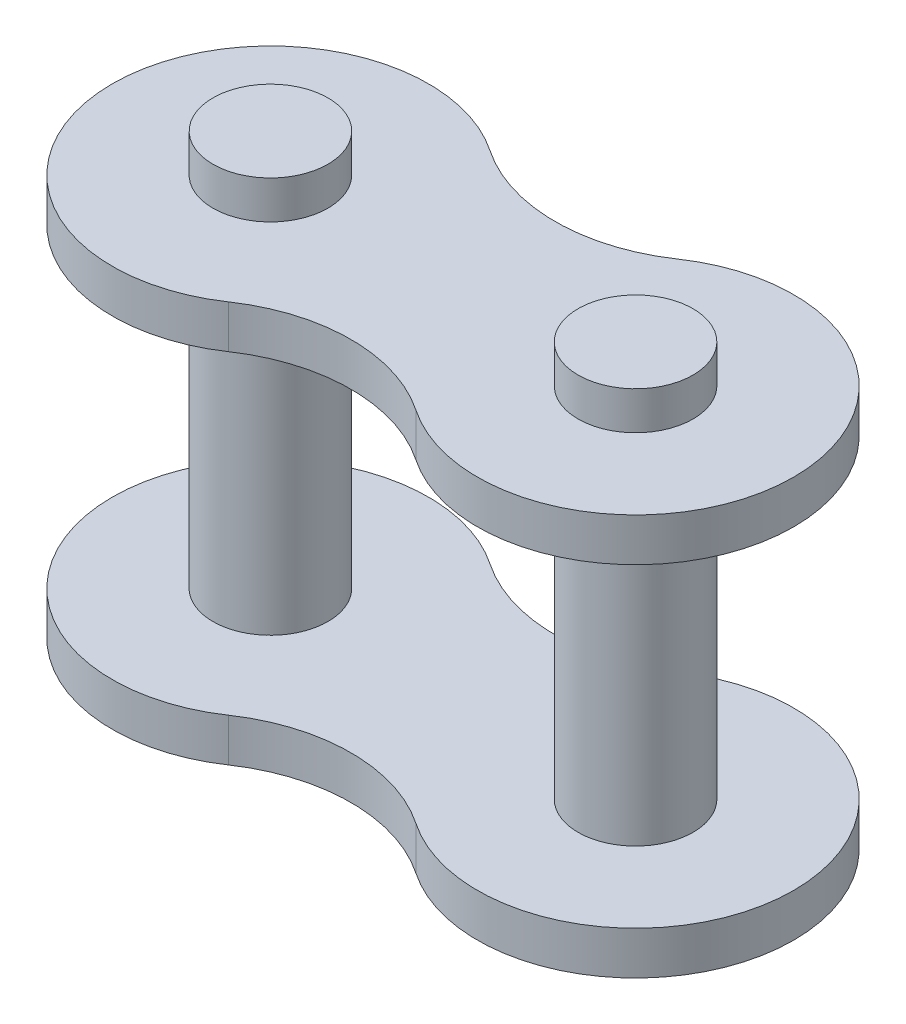
ISO-10303-21;
HEADER;
FILE_DESCRIPTION(('STEP AP214'),'2;1');
FILE_NAME('part.step','',(''),(''),'','','');
FILE_SCHEMA(('AUTOMOTIVE_DESIGN { 1 0 10303 214 1 1 1 1 }'));
ENDSEC;
DATA;
#1=APPLICATION_CONTEXT('core data for automotive mechanical design processes');
#2=APPLICATION_PROTOCOL_DEFINITION('international standard','automotive_design',2000,#1);
#3=PRODUCT_CONTEXT('',#1,'mechanical');
#4=PRODUCT('Part','Part','',(#3));
#5=PRODUCT_RELATED_PRODUCT_CATEGORY('part','',(#4));
#6=PRODUCT_DEFINITION_FORMATION('','',#4);
#7=PRODUCT_DEFINITION_CONTEXT('part definition',#1,'design');
#8=PRODUCT_DEFINITION('design','',#6,#7);
#9=PRODUCT_DEFINITION_SHAPE('','',#8);
#10=(LENGTH_UNIT() NAMED_UNIT(*) SI_UNIT(.MILLI.,.METRE.));
#11=(NAMED_UNIT(*) PLANE_ANGLE_UNIT() SI_UNIT($,.RADIAN.));
#12=(NAMED_UNIT(*) SI_UNIT($,.STERADIAN.) SOLID_ANGLE_UNIT());
#13=UNCERTAINTY_MEASURE_WITH_UNIT(LENGTH_MEASURE(1.E-05),#10,'distance_accuracy_value','');
#14=(GEOMETRIC_REPRESENTATION_CONTEXT(3) GLOBAL_UNCERTAINTY_ASSIGNED_CONTEXT((#13)) GLOBAL_UNIT_ASSIGNED_CONTEXT((#10,
#11,#12)) REPRESENTATION_CONTEXT('',''));
#15=CARTESIAN_POINT('',(0.,0.,0.));
#16=DIRECTION('',(0.,0.,1.));
#17=DIRECTION('',(1.,0.,0.));
#18=AXIS2_PLACEMENT_3D('',#15,#16,#17);
#19=CARTESIAN_POINT('',(6.35,-8.3,0.));
#20=DIRECTION('',(0.,1.,0.));
#21=DIRECTION('',(0.,0.,1.));
#22=AXIS2_PLACEMENT_3D('',#19,#20,#21);
#23=CYLINDRICAL_SURFACE('',#22,2.);
#24=CARTESIAN_POINT('',(6.35,-8.3,0.));
#25=DIRECTION('',(0.,1.,0.));
#26=DIRECTION('',(0.,0.,1.));
#27=AXIS2_PLACEMENT_3D('',#24,#25,#26);
#28=CIRCLE('',#27,2.);
#29=CARTESIAN_POINT('',(6.35,-8.3,2.));
#30=VERTEX_POINT('',#29);
#31=EDGE_CURVE('E11',#30,#30,#28,.T.);
#32=ORIENTED_EDGE('',*,*,#31,.T.);
#33=EDGE_LOOP('',(#32));
#34=FACE_BOUND('',#33,.T.);
#35=CARTESIAN_POINT('',(6.35,8.3,0.));
#36=DIRECTION('',(0.,1.,0.));
#37=DIRECTION('',(0.,0.,1.));
#38=AXIS2_PLACEMENT_3D('',#35,#36,#37);
#39=CIRCLE('',#38,2.);
#40=CARTESIAN_POINT('',(6.35,8.3,2.));
#41=VERTEX_POINT('',#40);
#42=EDGE_CURVE('E51',#41,#41,#39,.T.);
#43=ORIENTED_EDGE('',*,*,#42,.F.);
#44=EDGE_LOOP('',(#43));
#45=FACE_BOUND('',#44,.T.);
#46=ADVANCED_FACE('F45',(#34,#45),#23,.T.);
#47=CARTESIAN_POINT('',(8.35,-8.3,0.));
#48=DIRECTION('',(0.,-1.,0.));
#49=DIRECTION('',(0.,0.,-1.));
#50=AXIS2_PLACEMENT_3D('',#47,#48,#49);
#51=PLANE('',#50);
#52=ORIENTED_EDGE('',*,*,#31,.F.);
#53=EDGE_LOOP('',(#52));
#54=FACE_BOUND('',#53,.T.);
#55=ADVANCED_FACE('F60',(#54),#51,.T.);
#56=CARTESIAN_POINT('',(6.35,8.3,0.));
#57=DIRECTION('',(0.,1.,0.));
#58=DIRECTION('',(0.,0.,1.));
#59=AXIS2_PLACEMENT_3D('',#56,#57,#58);
#60=PLANE('',#59);
#61=ORIENTED_EDGE('',*,*,#42,.T.);
#62=EDGE_LOOP('',(#61));
#63=FACE_BOUND('',#62,.T.);
#64=ADVANCED_FACE('F57',(#63),#60,.T.);
#65=CLOSED_SHELL('',(#46,#55,#64));
#66=MANIFOLD_SOLID_BREP('B2',#65);
#67=CARTESIAN_POINT('',(-6.35,-8.3,0.));
#68=DIRECTION('',(0.,1.,0.));
#69=DIRECTION('',(0.,0.,1.));
#70=AXIS2_PLACEMENT_3D('',#67,#68,#69);
#71=CYLINDRICAL_SURFACE('',#70,2.);
#72=CARTESIAN_POINT('',(-6.35,-8.3,0.));
#73=DIRECTION('',(0.,1.,0.));
#74=DIRECTION('',(0.,0.,1.));
#75=AXIS2_PLACEMENT_3D('',#72,#73,#74);
#76=CIRCLE('',#75,2.);
#77=CARTESIAN_POINT('',(-6.35,-8.3,2.));
#78=VERTEX_POINT('',#77);
#79=EDGE_CURVE('E44',#78,#78,#76,.T.);
#80=ORIENTED_EDGE('',*,*,#79,.T.);
#81=EDGE_LOOP('',(#80));
#82=FACE_BOUND('',#81,.T.);
#83=CARTESIAN_POINT('',(-6.35,8.3,0.));
#84=DIRECTION('',(0.,1.,0.));
#85=DIRECTION('',(0.,0.,1.));
#86=AXIS2_PLACEMENT_3D('',#83,#84,#85);
#87=CIRCLE('',#86,2.);
#88=CARTESIAN_POINT('',(-6.35,8.3,2.));
#89=VERTEX_POINT('',#88);
#90=EDGE_CURVE('E101',#89,#89,#87,.T.);
#91=ORIENTED_EDGE('',*,*,#90,.F.);
#92=EDGE_LOOP('',(#91));
#93=FACE_BOUND('',#92,.T.);
#94=ADVANCED_FACE('F95',(#82,#93),#71,.T.);
#95=CARTESIAN_POINT('',(-4.35,-8.3,0.));
#96=DIRECTION('',(0.,-1.,0.));
#97=DIRECTION('',(0.,0.,-1.));
#98=AXIS2_PLACEMENT_3D('',#95,#96,#97);
#99=PLANE('',#98);
#100=ORIENTED_EDGE('',*,*,#79,.F.);
#101=EDGE_LOOP('',(#100));
#102=FACE_BOUND('',#101,.T.);
#103=ADVANCED_FACE('F110',(#102),#99,.T.);
#104=CARTESIAN_POINT('',(-6.35,8.3,0.));
#105=DIRECTION('',(0.,1.,0.));
#106=DIRECTION('',(0.,0.,1.));
#107=AXIS2_PLACEMENT_3D('',#104,#105,#106);
#108=PLANE('',#107);
#109=ORIENTED_EDGE('',*,*,#90,.T.);
#110=EDGE_LOOP('',(#109));
#111=FACE_BOUND('',#110,.T.);
#112=ADVANCED_FACE('F107',(#111),#108,.T.);
#113=CLOSED_SHELL('',(#94,#103,#112));
#114=MANIFOLD_SOLID_BREP('B6',#113);
#115=CARTESIAN_POINT('',(-6.35,-5.475,0.));
#116=DIRECTION('',(0.,-1.,0.));
#117=DIRECTION('',(0.,0.,-1.));
#118=AXIS2_PLACEMENT_3D('',#115,#116,#117);
#119=CYLINDRICAL_SURFACE('',#118,5.5);
#120=CARTESIAN_POINT('',(-6.35,-6.975,0.));
#121=DIRECTION('',(0.,-1.,0.));
#122=DIRECTION('',(0.,0.,-1.));
#123=AXIS2_PLACEMENT_3D('',#120,#121,#122);
#124=CIRCLE('',#123,5.5);
#125=CARTESIAN_POINT('',(-3.26314447592056,-6.975,4.55206798866847));
#126=VERTEX_POINT('',#125);
#127=CARTESIAN_POINT('',(-3.26314447592056,-6.975,-4.55206798866847));
#128=VERTEX_POINT('',#127);
#129=EDGE_CURVE('E209',#126,#128,#124,.T.);
#130=ORIENTED_EDGE('',*,*,#129,.F.);
#131=DIRECTION('',(0.,-1.,0.));
#132=VECTOR('',#131,1.);
#133=CARTESIAN_POINT('',(-3.26314447592056,-5.475,4.55206798866847));
#134=LINE('',#133,#132);
#135=CARTESIAN_POINT('',(-3.26314447592056,-5.475,4.55206798866847));
#136=VERTEX_POINT('',#135);
#137=EDGE_CURVE('E93',#136,#126,#134,.T.);
#138=ORIENTED_EDGE('',*,*,#137,.F.);
#139=CARTESIAN_POINT('',(-6.35,-5.475,0.));
#140=DIRECTION('',(0.,-1.,0.));
#141=DIRECTION('',(0.,0.,-1.));
#142=AXIS2_PLACEMENT_3D('',#139,#140,#141);
#143=CIRCLE('',#142,5.5);
#144=CARTESIAN_POINT('',(-3.26314447592056,-5.475,-4.55206798866847));
#145=VERTEX_POINT('',#144);
#146=EDGE_CURVE('E202',#136,#145,#143,.T.);
#147=ORIENTED_EDGE('',*,*,#146,.T.);
#148=DIRECTION('',(0.,-1.,0.));
#149=VECTOR('',#148,1.);
#150=CARTESIAN_POINT('',(-3.26314447592056,-5.475,-4.55206798866847));
#151=LINE('',#150,#149);
#152=EDGE_CURVE('E147',#145,#128,#151,.T.);
#153=ORIENTED_EDGE('',*,*,#152,.T.);
#154=EDGE_LOOP('',(#130,#138,#147,#153));
#155=FACE_BOUND('',#154,.T.);
#156=ADVANCED_FACE('F144',(#155),#119,.T.);
#157=CARTESIAN_POINT('',(0.,-5.475,9.36410256410201));
#158=DIRECTION('',(0.,-1.,0.));
#159=DIRECTION('',(0.,0.,-1.));
#160=AXIS2_PLACEMENT_3D('',#157,#158,#159);
#161=CYLINDRICAL_SURFACE('',#160,5.81410256410211);
#162=CARTESIAN_POINT('',(0.,-6.975,9.36410256410201));
#163=DIRECTION('',(0.,1.,0.));
#164=DIRECTION('',(0.,0.,1.));
#165=AXIS2_PLACEMENT_3D('',#162,#163,#164);
#166=CIRCLE('',#165,5.81410256410211);
#167=CARTESIAN_POINT('',(3.26314447592055,-6.975,4.55206798866847));
#168=VERTEX_POINT('',#167);
#169=EDGE_CURVE('E204',#168,#126,#166,.T.);
#170=ORIENTED_EDGE('',*,*,#169,.F.);
#171=DIRECTION('',(0.,-1.,0.));
#172=VECTOR('',#171,1.);
#173=CARTESIAN_POINT('',(3.26314447592055,-5.475,4.55206798866847));
#174=LINE('',#173,#172);
#175=CARTESIAN_POINT('',(3.26314447592055,-5.475,4.55206798866847));
#176=VERTEX_POINT('',#175);
#177=EDGE_CURVE('E153',#176,#168,#174,.T.);
#178=ORIENTED_EDGE('',*,*,#177,.F.);
#179=CARTESIAN_POINT('',(0.,-5.475,9.36410256410201));
#180=DIRECTION('',(0.,1.,0.));
#181=DIRECTION('',(0.,0.,1.));
#182=AXIS2_PLACEMENT_3D('',#179,#180,#181);
#183=CIRCLE('',#182,5.81410256410211);
#184=EDGE_CURVE('E199',#176,#136,#183,.T.);
#185=ORIENTED_EDGE('',*,*,#184,.T.);
#186=ORIENTED_EDGE('',*,*,#137,.T.);
#187=EDGE_LOOP('',(#170,#178,#185,#186));
#188=FACE_BOUND('',#187,.T.);
#189=ADVANCED_FACE('F220',(#188),#161,.F.);
#190=CARTESIAN_POINT('',(6.35,-5.475,0.));
#191=DIRECTION('',(0.,-1.,0.));
#192=DIRECTION('',(0.,0.,-1.));
#193=AXIS2_PLACEMENT_3D('',#190,#191,#192);
#194=CYLINDRICAL_SURFACE('',#193,5.5);
#195=CARTESIAN_POINT('',(6.35,-6.975,0.));
#196=DIRECTION('',(0.,-1.,0.));
#197=DIRECTION('',(0.,0.,-1.));
#198=AXIS2_PLACEMENT_3D('',#195,#196,#197);
#199=CIRCLE('',#198,5.5);
#200=CARTESIAN_POINT('',(3.26314447592056,-6.975,-4.55206798866847));
#201=VERTEX_POINT('',#200);
#202=EDGE_CURVE('E194',#201,#168,#199,.T.);
#203=ORIENTED_EDGE('',*,*,#202,.F.);
#204=DIRECTION('',(0.,-1.,0.));
#205=VECTOR('',#204,1.);
#206=CARTESIAN_POINT('',(3.26314447592056,-5.475,-4.55206798866847));
#207=LINE('',#206,#205);
#208=CARTESIAN_POINT('',(3.26314447592056,-5.475,-4.55206798866847));
#209=VERTEX_POINT('',#208);
#210=EDGE_CURVE('E189',#209,#201,#207,.T.);
#211=ORIENTED_EDGE('',*,*,#210,.F.);
#212=CARTESIAN_POINT('',(6.35,-5.475,0.));
#213=DIRECTION('',(0.,-1.,0.));
#214=DIRECTION('',(0.,0.,-1.));
#215=AXIS2_PLACEMENT_3D('',#212,#213,#214);
#216=CIRCLE('',#215,5.5);
#217=EDGE_CURVE('E192',#209,#176,#216,.T.);
#218=ORIENTED_EDGE('',*,*,#217,.T.);
#219=ORIENTED_EDGE('',*,*,#177,.T.);
#220=EDGE_LOOP('',(#203,#211,#218,#219));
#221=FACE_BOUND('',#220,.T.);
#222=ADVANCED_FACE('F191',(#221),#194,.T.);
#223=CARTESIAN_POINT('',(0.,-5.475,-9.36410256410201));
#224=DIRECTION('',(0.,-1.,0.));
#225=DIRECTION('',(0.,0.,-1.));
#226=AXIS2_PLACEMENT_3D('',#223,#224,#225);
#227=CYLINDRICAL_SURFACE('',#226,5.81410256410211);
#228=CARTESIAN_POINT('',(0.,-6.975,-9.36410256410201));
#229=DIRECTION('',(0.,1.,0.));
#230=DIRECTION('',(0.,0.,1.));
#231=AXIS2_PLACEMENT_3D('',#228,#229,#230);
#232=CIRCLE('',#231,5.81410256410211);
#233=EDGE_CURVE('E212',#128,#201,#232,.T.);
#234=ORIENTED_EDGE('',*,*,#233,.F.);
#235=ORIENTED_EDGE('',*,*,#152,.F.);
#236=CARTESIAN_POINT('',(0.,-5.475,-9.36410256410201));
#237=DIRECTION('',(0.,1.,0.));
#238=DIRECTION('',(0.,0.,1.));
#239=AXIS2_PLACEMENT_3D('',#236,#237,#238);
#240=CIRCLE('',#239,5.81410256410211);
#241=EDGE_CURVE('E198',#145,#209,#240,.T.);
#242=ORIENTED_EDGE('',*,*,#241,.T.);
#243=ORIENTED_EDGE('',*,*,#210,.T.);
#244=EDGE_LOOP('',(#234,#235,#242,#243));
#245=FACE_BOUND('',#244,.T.);
#246=ADVANCED_FACE('F201',(#245),#227,.F.);
#247=CARTESIAN_POINT('',(-3.175,-5.475,-4.68205128205101));
#248=DIRECTION('',(0.,-1.,0.));
#249=DIRECTION('',(0.,0.,-1.));
#250=AXIS2_PLACEMENT_3D('',#247,#248,#249);
#251=PLANE('',#250);
#252=CARTESIAN_POINT('',(-6.35,-5.475,0.));
#253=DIRECTION('',(0.,-1.,0.));
#254=DIRECTION('',(0.,0.,-1.));
#255=AXIS2_PLACEMENT_3D('',#252,#253,#254);
#256=CIRCLE('',#255,2.);
#257=CARTESIAN_POINT('',(-6.35,-5.475,-2.));
#258=VERTEX_POINT('',#257);
#259=EDGE_CURVE('E253',#258,#258,#256,.T.);
#260=ORIENTED_EDGE('',*,*,#259,.T.);
#261=EDGE_LOOP('',(#260));
#262=FACE_BOUND('',#261,.T.);
#263=CARTESIAN_POINT('',(6.35,-5.475,0.));
#264=DIRECTION('',(0.,-1.,0.));
#265=DIRECTION('',(0.,0.,-1.));
#266=AXIS2_PLACEMENT_3D('',#263,#264,#265);
#267=CIRCLE('',#266,2.);
#268=CARTESIAN_POINT('',(6.35,-5.475,-2.));
#269=VERTEX_POINT('',#268);
#270=EDGE_CURVE('E213',#269,#269,#267,.T.);
#271=ORIENTED_EDGE('',*,*,#270,.T.);
#272=EDGE_LOOP('',(#271));
#273=FACE_BOUND('',#272,.T.);
#274=ORIENTED_EDGE('',*,*,#146,.F.);
#275=ORIENTED_EDGE('',*,*,#184,.F.);
#276=ORIENTED_EDGE('',*,*,#217,.F.);
#277=ORIENTED_EDGE('',*,*,#241,.F.);
#278=EDGE_LOOP('',(#274,#275,#276,#277));
#279=FACE_BOUND('',#278,.T.);
#280=ADVANCED_FACE('F197',(#262,#273,#279),#251,.F.);
#281=CARTESIAN_POINT('',(-3.175,-6.975,-4.68205128205101));
#282=DIRECTION('',(0.,-1.,0.));
#283=DIRECTION('',(0.,0.,-1.));
#284=AXIS2_PLACEMENT_3D('',#281,#282,#283);
#285=PLANE('',#284);
#286=CARTESIAN_POINT('',(-6.35,-6.975,0.));
#287=DIRECTION('',(0.,-1.,0.));
#288=DIRECTION('',(0.,0.,-1.));
#289=AXIS2_PLACEMENT_3D('',#286,#287,#288);
#290=CIRCLE('',#289,2.);
#291=CARTESIAN_POINT('',(-6.35,-6.975,-2.));
#292=VERTEX_POINT('',#291);
#293=EDGE_CURVE('E256',#292,#292,#290,.T.);
#294=ORIENTED_EDGE('',*,*,#293,.F.);
#295=EDGE_LOOP('',(#294));
#296=FACE_BOUND('',#295,.T.);
#297=CARTESIAN_POINT('',(6.35,-6.975,0.));
#298=DIRECTION('',(0.,-1.,0.));
#299=DIRECTION('',(0.,0.,-1.));
#300=AXIS2_PLACEMENT_3D('',#297,#298,#299);
#301=CIRCLE('',#300,2.);
#302=CARTESIAN_POINT('',(6.35,-6.975,-2.));
#303=VERTEX_POINT('',#302);
#304=EDGE_CURVE('E258',#303,#303,#301,.T.);
#305=ORIENTED_EDGE('',*,*,#304,.F.);
#306=EDGE_LOOP('',(#305));
#307=FACE_BOUND('',#306,.T.);
#308=ORIENTED_EDGE('',*,*,#129,.T.);
#309=ORIENTED_EDGE('',*,*,#233,.T.);
#310=ORIENTED_EDGE('',*,*,#202,.T.);
#311=ORIENTED_EDGE('',*,*,#169,.T.);
#312=EDGE_LOOP('',(#308,#309,#310,#311));
#313=FACE_BOUND('',#312,.T.);
#314=ADVANCED_FACE('F219',(#296,#307,#313),#285,.T.);
#315=CARTESIAN_POINT('',(6.35,-5.475,0.));
#316=DIRECTION('',(0.,-1.,0.));
#317=DIRECTION('',(0.,0.,-1.));
#318=AXIS2_PLACEMENT_3D('',#315,#316,#317);
#319=CYLINDRICAL_SURFACE('',#318,2.);
#320=ORIENTED_EDGE('',*,*,#270,.F.);
#321=EDGE_LOOP('',(#320));
#322=FACE_BOUND('',#321,.T.);
#323=ORIENTED_EDGE('',*,*,#304,.T.);
#324=EDGE_LOOP('',(#323));
#325=FACE_BOUND('',#324,.T.);
#326=ADVANCED_FACE('F238',(#322,#325),#319,.F.);
#327=CARTESIAN_POINT('',(-6.35,-5.475,0.));
#328=DIRECTION('',(0.,-1.,0.));
#329=DIRECTION('',(0.,0.,-1.));
#330=AXIS2_PLACEMENT_3D('',#327,#328,#329);
#331=CYLINDRICAL_SURFACE('',#330,2.);
#332=ORIENTED_EDGE('',*,*,#259,.F.);
#333=EDGE_LOOP('',(#332));
#334=FACE_BOUND('',#333,.T.);
#335=ORIENTED_EDGE('',*,*,#293,.T.);
#336=EDGE_LOOP('',(#335));
#337=FACE_BOUND('',#336,.T.);
#338=ADVANCED_FACE('F245',(#334,#337),#331,.F.);
#339=CLOSED_SHELL('',(#156,#189,#222,#246,#280,#314,#326,#338));
#340=MANIFOLD_SOLID_BREP('B39',#339);
#341=CARTESIAN_POINT('',(6.35,5.475,0.));
#342=DIRECTION('',(0.,1.,0.));
#343=DIRECTION('',(0.,0.,1.));
#344=AXIS2_PLACEMENT_3D('',#341,#342,#343);
#345=CYLINDRICAL_SURFACE('',#344,5.5);
#346=CARTESIAN_POINT('',(6.35,6.975,0.));
#347=DIRECTION('',(0.,1.,0.));
#348=DIRECTION('',(0.,0.,1.));
#349=AXIS2_PLACEMENT_3D('',#346,#347,#348);
#350=CIRCLE('',#349,5.5);
#351=CARTESIAN_POINT('',(3.26314447592055,6.975,4.55206798866847));
#352=VERTEX_POINT('',#351);
#353=CARTESIAN_POINT('',(3.26314447592056,6.975,-4.55206798866847));
#354=VERTEX_POINT('',#353);
#355=EDGE_CURVE('E374',#352,#354,#350,.T.);
#356=ORIENTED_EDGE('',*,*,#355,.F.);
#357=DIRECTION('',(0.,1.,0.));
#358=VECTOR('',#357,1.);
#359=CARTESIAN_POINT('',(3.26314447592055,5.475,4.55206798866847));
#360=LINE('',#359,#358);
#361=CARTESIAN_POINT('',(3.26314447592055,5.475,4.55206798866847));
#362=VERTEX_POINT('',#361);
#363=EDGE_CURVE('E142',#362,#352,#360,.T.);
#364=ORIENTED_EDGE('',*,*,#363,.F.);
#365=CARTESIAN_POINT('',(6.35,5.475,0.));
#366=DIRECTION('',(0.,1.,0.));
#367=DIRECTION('',(0.,0.,1.));
#368=AXIS2_PLACEMENT_3D('',#365,#366,#367);
#369=CIRCLE('',#368,5.5);
#370=CARTESIAN_POINT('',(3.26314447592056,5.475,-4.55206798866847));
#371=VERTEX_POINT('',#370);
#372=EDGE_CURVE('E367',#362,#371,#369,.T.);
#373=ORIENTED_EDGE('',*,*,#372,.T.);
#374=DIRECTION('',(0.,1.,0.));
#375=VECTOR('',#374,1.);
#376=CARTESIAN_POINT('',(3.26314447592056,5.475,-4.55206798866847));
#377=LINE('',#376,#375);
#378=EDGE_CURVE('E312',#371,#354,#377,.T.);
#379=ORIENTED_EDGE('',*,*,#378,.T.);
#380=EDGE_LOOP('',(#356,#364,#373,#379));
#381=FACE_BOUND('',#380,.T.);
#382=ADVANCED_FACE('F309',(#381),#345,.T.);
#383=CARTESIAN_POINT('',(0.,5.475,9.36410256410201));
#384=DIRECTION('',(0.,1.,0.));
#385=DIRECTION('',(0.,0.,1.));
#386=AXIS2_PLACEMENT_3D('',#383,#384,#385);
#387=CYLINDRICAL_SURFACE('',#386,5.81410256410211);
#388=CARTESIAN_POINT('',(0.,6.975,9.36410256410201));
#389=DIRECTION('',(0.,-1.,0.));
#390=DIRECTION('',(0.,0.,-1.));
#391=AXIS2_PLACEMENT_3D('',#388,#389,#390);
#392=CIRCLE('',#391,5.81410256410211);
#393=CARTESIAN_POINT('',(-3.26314447592056,6.975,4.55206798866847));
#394=VERTEX_POINT('',#393);
#395=EDGE_CURVE('E369',#394,#352,#392,.T.);
#396=ORIENTED_EDGE('',*,*,#395,.F.);
#397=DIRECTION('',(0.,1.,0.));
#398=VECTOR('',#397,1.);
#399=CARTESIAN_POINT('',(-3.26314447592056,5.475,4.55206798866847));
#400=LINE('',#399,#398);
#401=CARTESIAN_POINT('',(-3.26314447592056,5.475,4.55206798866847));
#402=VERTEX_POINT('',#401);
#403=EDGE_CURVE('E318',#402,#394,#400,.T.);
#404=ORIENTED_EDGE('',*,*,#403,.F.);
#405=CARTESIAN_POINT('',(0.,5.475,9.36410256410201));
#406=DIRECTION('',(0.,-1.,0.));
#407=DIRECTION('',(0.,0.,-1.));
#408=AXIS2_PLACEMENT_3D('',#405,#406,#407);
#409=CIRCLE('',#408,5.81410256410211);
#410=EDGE_CURVE('E364',#402,#362,#409,.T.);
#411=ORIENTED_EDGE('',*,*,#410,.T.);
#412=ORIENTED_EDGE('',*,*,#363,.T.);
#413=EDGE_LOOP('',(#396,#404,#411,#412));
#414=FACE_BOUND('',#413,.T.);
#415=ADVANCED_FACE('F385',(#414),#387,.F.);
#416=CARTESIAN_POINT('',(-6.35,5.475,0.));
#417=DIRECTION('',(0.,1.,0.));
#418=DIRECTION('',(0.,0.,1.));
#419=AXIS2_PLACEMENT_3D('',#416,#417,#418);
#420=CYLINDRICAL_SURFACE('',#419,5.5);
#421=CARTESIAN_POINT('',(-6.35,6.975,0.));
#422=DIRECTION('',(0.,1.,0.));
#423=DIRECTION('',(0.,0.,1.));
#424=AXIS2_PLACEMENT_3D('',#421,#422,#423);
#425=CIRCLE('',#424,5.5);
#426=CARTESIAN_POINT('',(-3.26314447592056,6.975,-4.55206798866847));
#427=VERTEX_POINT('',#426);
#428=EDGE_CURVE('E359',#427,#394,#425,.T.);
#429=ORIENTED_EDGE('',*,*,#428,.F.);
#430=DIRECTION('',(0.,1.,0.));
#431=VECTOR('',#430,1.);
#432=CARTESIAN_POINT('',(-3.26314447592056,5.475,-4.55206798866847));
#433=LINE('',#432,#431);
#434=CARTESIAN_POINT('',(-3.26314447592056,5.475,-4.55206798866847));
#435=VERTEX_POINT('',#434);
#436=EDGE_CURVE('E354',#435,#427,#433,.T.);
#437=ORIENTED_EDGE('',*,*,#436,.F.);
#438=CARTESIAN_POINT('',(-6.35,5.475,0.));
#439=DIRECTION('',(0.,1.,0.));
#440=DIRECTION('',(0.,0.,1.));
#441=AXIS2_PLACEMENT_3D('',#438,#439,#440);
#442=CIRCLE('',#441,5.5);
#443=EDGE_CURVE('E357',#435,#402,#442,.T.);
#444=ORIENTED_EDGE('',*,*,#443,.T.);
#445=ORIENTED_EDGE('',*,*,#403,.T.);
#446=EDGE_LOOP('',(#429,#437,#444,#445));
#447=FACE_BOUND('',#446,.T.);
#448=ADVANCED_FACE('F356',(#447),#420,.T.);
#449=CARTESIAN_POINT('',(0.,5.475,-9.36410256410201));
#450=DIRECTION('',(0.,1.,0.));
#451=DIRECTION('',(0.,0.,1.));
#452=AXIS2_PLACEMENT_3D('',#449,#450,#451);
#453=CYLINDRICAL_SURFACE('',#452,5.81410256410211);
#454=CARTESIAN_POINT('',(0.,6.975,-9.36410256410201));
#455=DIRECTION('',(0.,-1.,0.));
#456=DIRECTION('',(0.,0.,-1.));
#457=AXIS2_PLACEMENT_3D('',#454,#455,#456);
#458=CIRCLE('',#457,5.81410256410211);
#459=EDGE_CURVE('E377',#354,#427,#458,.T.);
#460=ORIENTED_EDGE('',*,*,#459,.F.);
#461=ORIENTED_EDGE('',*,*,#378,.F.);
#462=CARTESIAN_POINT('',(0.,5.475,-9.36410256410201));
#463=DIRECTION('',(0.,-1.,0.));
#464=DIRECTION('',(0.,0.,-1.));
#465=AXIS2_PLACEMENT_3D('',#462,#463,#464);
#466=CIRCLE('',#465,5.81410256410211);
#467=EDGE_CURVE('E363',#371,#435,#466,.T.);
#468=ORIENTED_EDGE('',*,*,#467,.T.);
#469=ORIENTED_EDGE('',*,*,#436,.T.);
#470=EDGE_LOOP('',(#460,#461,#468,#469));
#471=FACE_BOUND('',#470,.T.);
#472=ADVANCED_FACE('F366',(#471),#453,.F.);
#473=CARTESIAN_POINT('',(3.175,5.475,-4.68205128205101));
#474=DIRECTION('',(0.,1.,0.));
#475=DIRECTION('',(0.,0.,1.));
#476=AXIS2_PLACEMENT_3D('',#473,#474,#475);
#477=PLANE('',#476);
#478=CARTESIAN_POINT('',(-6.35,5.475,0.));
#479=DIRECTION('',(0.,1.,0.));
#480=DIRECTION('',(0.,0.,1.));
#481=AXIS2_PLACEMENT_3D('',#478,#479,#480);
#482=CIRCLE('',#481,2.);
#483=CARTESIAN_POINT('',(-6.35,5.475,2.));
#484=VERTEX_POINT('',#483);
#485=EDGE_CURVE('E418',#484,#484,#482,.T.);
#486=ORIENTED_EDGE('',*,*,#485,.T.);
#487=EDGE_LOOP('',(#486));
#488=FACE_BOUND('',#487,.T.);
#489=CARTESIAN_POINT('',(6.35,5.475,0.));
#490=DIRECTION('',(0.,1.,0.));
#491=DIRECTION('',(0.,0.,1.));
#492=AXIS2_PLACEMENT_3D('',#489,#490,#491);
#493=CIRCLE('',#492,2.);
#494=CARTESIAN_POINT('',(6.35,5.475,2.));
#495=VERTEX_POINT('',#494);
#496=EDGE_CURVE('E378',#495,#495,#493,.T.);
#497=ORIENTED_EDGE('',*,*,#496,.T.);
#498=EDGE_LOOP('',(#497));
#499=FACE_BOUND('',#498,.T.);
#500=ORIENTED_EDGE('',*,*,#372,.F.);
#501=ORIENTED_EDGE('',*,*,#410,.F.);
#502=ORIENTED_EDGE('',*,*,#443,.F.);
#503=ORIENTED_EDGE('',*,*,#467,.F.);
#504=EDGE_LOOP('',(#500,#501,#502,#503));
#505=FACE_BOUND('',#504,.T.);
#506=ADVANCED_FACE('F362',(#488,#499,#505),#477,.F.);
#507=CARTESIAN_POINT('',(3.175,6.975,-4.68205128205101));
#508=DIRECTION('',(0.,1.,0.));
#509=DIRECTION('',(0.,0.,1.));
#510=AXIS2_PLACEMENT_3D('',#507,#508,#509);
#511=PLANE('',#510);
#512=CARTESIAN_POINT('',(-6.35,6.975,0.));
#513=DIRECTION('',(0.,1.,0.));
#514=DIRECTION('',(0.,0.,1.));
#515=AXIS2_PLACEMENT_3D('',#512,#513,#514);
#516=CIRCLE('',#515,2.);
#517=CARTESIAN_POINT('',(-6.35,6.975,2.));
#518=VERTEX_POINT('',#517);
#519=EDGE_CURVE('E421',#518,#518,#516,.T.);
#520=ORIENTED_EDGE('',*,*,#519,.F.);
#521=EDGE_LOOP('',(#520));
#522=FACE_BOUND('',#521,.T.);
#523=CARTESIAN_POINT('',(6.35,6.975,0.));
#524=DIRECTION('',(0.,1.,0.));
#525=DIRECTION('',(0.,0.,1.));
#526=AXIS2_PLACEMENT_3D('',#523,#524,#525);
#527=CIRCLE('',#526,2.);
#528=CARTESIAN_POINT('',(6.35,6.975,2.));
#529=VERTEX_POINT('',#528);
#530=EDGE_CURVE('E423',#529,#529,#527,.T.);
#531=ORIENTED_EDGE('',*,*,#530,.F.);
#532=EDGE_LOOP('',(#531));
#533=FACE_BOUND('',#532,.T.);
#534=ORIENTED_EDGE('',*,*,#355,.T.);
#535=ORIENTED_EDGE('',*,*,#459,.T.);
#536=ORIENTED_EDGE('',*,*,#428,.T.);
#537=ORIENTED_EDGE('',*,*,#395,.T.);
#538=EDGE_LOOP('',(#534,#535,#536,#537));
#539=FACE_BOUND('',#538,.T.);
#540=ADVANCED_FACE('F384',(#522,#533,#539),#511,.T.);
#541=CARTESIAN_POINT('',(6.35,5.475,0.));
#542=DIRECTION('',(0.,1.,0.));
#543=DIRECTION('',(0.,0.,1.));
#544=AXIS2_PLACEMENT_3D('',#541,#542,#543);
#545=CYLINDRICAL_SURFACE('',#544,2.);
#546=CARTESIAN_POINT('',(6.35,5.475,2.));
#547=CARTESIAN_POINT('',(6.35,5.490625,2.));
#548=CARTESIAN_POINT('',(6.35,5.50625,2.));
#549=CARTESIAN_POINT('',(6.35,5.5375,2.));
#550=CARTESIAN_POINT('',(6.35,5.553125,2.));
#551=CARTESIAN_POINT('',(6.35,5.584375,2.));
#552=CARTESIAN_POINT('',(6.35,5.6,2.));
#553=CARTESIAN_POINT('',(6.35,5.63125,2.));
#554=CARTESIAN_POINT('',(6.35,5.646875,2.));
#555=CARTESIAN_POINT('',(6.35,5.678125,2.));
#556=CARTESIAN_POINT('',(6.35,5.69375,2.));
#557=CARTESIAN_POINT('',(6.35,5.725,2.));
#558=CARTESIAN_POINT('',(6.35,5.740625,2.));
#559=CARTESIAN_POINT('',(6.35,5.771875,2.));
#560=CARTESIAN_POINT('',(6.35,5.7875,2.));
#561=CARTESIAN_POINT('',(6.35,5.81875,2.));
#562=CARTESIAN_POINT('',(6.35,5.834375,2.));
#563=CARTESIAN_POINT('',(6.35,5.865625,2.));
#564=CARTESIAN_POINT('',(6.35,5.88125,2.));
#565=CARTESIAN_POINT('',(6.35,5.9125,2.));
#566=CARTESIAN_POINT('',(6.35,5.928125,2.));
#567=CARTESIAN_POINT('',(6.35,5.959375,2.));
#568=CARTESIAN_POINT('',(6.35,5.975,2.));
#569=CARTESIAN_POINT('',(6.35,6.00625,2.));
#570=CARTESIAN_POINT('',(6.35,6.021875,2.));
#571=CARTESIAN_POINT('',(6.35,6.053125,2.));
#572=CARTESIAN_POINT('',(6.35,6.06875,2.));
#573=CARTESIAN_POINT('',(6.35,6.1,2.));
#574=CARTESIAN_POINT('',(6.35,6.115625,2.));
#575=CARTESIAN_POINT('',(6.35,6.146875,2.));
#576=CARTESIAN_POINT('',(6.35,6.1625,2.));
#577=CARTESIAN_POINT('',(6.35,6.19375,2.));
#578=CARTESIAN_POINT('',(6.35,6.209375,2.));
#579=CARTESIAN_POINT('',(6.35,6.240625,2.));
#580=CARTESIAN_POINT('',(6.35,6.25625,2.));
#581=CARTESIAN_POINT('',(6.35,6.2875,2.));
#582=CARTESIAN_POINT('',(6.35,6.303125,2.));
#583=CARTESIAN_POINT('',(6.35,6.334375,2.));
#584=CARTESIAN_POINT('',(6.35,6.35,2.));
#585=CARTESIAN_POINT('',(6.35,6.38125,2.));
#586=CARTESIAN_POINT('',(6.35,6.396875,2.));
#587=CARTESIAN_POINT('',(6.35,6.428125,2.));
#588=CARTESIAN_POINT('',(6.35,6.44375,2.));
#589=CARTESIAN_POINT('',(6.35,6.475,2.));
#590=CARTESIAN_POINT('',(6.35,6.490625,2.));
#591=CARTESIAN_POINT('',(6.35,6.521875,2.));
#592=CARTESIAN_POINT('',(6.35,6.5375,2.));
#593=CARTESIAN_POINT('',(6.35,6.56875,2.));
#594=CARTESIAN_POINT('',(6.35,6.584375,2.));
#595=CARTESIAN_POINT('',(6.35,6.615625,2.));
#596=CARTESIAN_POINT('',(6.35,6.63125,2.));
#597=CARTESIAN_POINT('',(6.35,6.6625,2.));
#598=CARTESIAN_POINT('',(6.35,6.678125,2.));
#599=CARTESIAN_POINT('',(6.35,6.709375,2.));
#600=CARTESIAN_POINT('',(6.35,6.725,2.));
#601=CARTESIAN_POINT('',(6.35,6.75625,2.));
#602=CARTESIAN_POINT('',(6.35,6.771875,2.));
#603=CARTESIAN_POINT('',(6.35,6.803125,2.));
#604=CARTESIAN_POINT('',(6.35,6.81875,2.));
#605=CARTESIAN_POINT('',(6.35,6.85,2.));
#606=CARTESIAN_POINT('',(6.35,6.865625,2.));
#607=CARTESIAN_POINT('',(6.35,6.896875,2.));
#608=CARTESIAN_POINT('',(6.35,6.9125,2.));
#609=CARTESIAN_POINT('',(6.35,6.94375,2.));
#610=CARTESIAN_POINT('',(6.35,6.959375,2.));
#611=CARTESIAN_POINT('',(6.35,6.975,2.));
#612=B_SPLINE_CURVE_WITH_KNOTS('',3,(#546,#547,#548,#549,#550,#551,#552,#553,#554,#555,#556,
#557,#558,#559,#560,#561,#562,#563,#564,#565,#566,#567,#568,#569,#570,#571,#572,#573,#574,#575,
#576,#577,#578,#579,#580,#581,#582,#583,#584,#585,#586,#587,#588,#589,#590,#591,#592,#593,#594,
#595,#596,#597,#598,#599,#600,#601,#602,#603,#604,#605,#606,#607,#608,#609,#610,#611),
.UNSPECIFIED.,.F.,.F.,(4,2,2,2,2,2,2,2,2,2,2,2,2,2,2,2,2,2,2,2,2,2,2,2,2,2,2,2,2,2,2,2,4),(0.,
0.0468749999999992,0.0937499999999992,0.140624999999999,0.187499999999999,0.234374999999999,
0.281249999999999,0.328124999999999,0.374999999999999,0.421875,0.46875,0.515625,0.5625,0.609375,
0.65625,0.703125,0.75,0.796875,0.84375,0.890625,0.9375,0.984375,1.03125,1.078125,1.125,1.171875,
1.21875,1.265625,1.3125,1.359375,1.40625,1.453125,1.5),.UNSPECIFIED.);
#613=EDGE_CURVE('BSEAM403',#495,#529,#612,.T.);
#614=ORIENTED_EDGE('',*,*,#496,.F.);
#615=ORIENTED_EDGE('',*,*,#530,.T.);
#616=ORIENTED_EDGE('',*,*,#613,.T.);
#617=ORIENTED_EDGE('',*,*,#613,.F.);
#618=EDGE_LOOP('',(#614,#616,#615,#617));
#619=FACE_BOUND('',#618,.T.);
#620=ADVANCED_FACE('F403',(#619),#545,.F.);
#621=CARTESIAN_POINT('',(-6.35,5.475,0.));
#622=DIRECTION('',(0.,1.,0.));
#623=DIRECTION('',(0.,0.,1.));
#624=AXIS2_PLACEMENT_3D('',#621,#622,#623);
#625=CYLINDRICAL_SURFACE('',#624,2.);
#626=CARTESIAN_POINT('',(-6.35,5.475,2.));
#627=CARTESIAN_POINT('',(-6.35,5.490625,2.));
#628=CARTESIAN_POINT('',(-6.35,5.50625,2.));
#629=CARTESIAN_POINT('',(-6.35,5.5375,2.));
#630=CARTESIAN_POINT('',(-6.35,5.553125,2.));
#631=CARTESIAN_POINT('',(-6.35,5.584375,2.));
#632=CARTESIAN_POINT('',(-6.35,5.6,2.));
#633=CARTESIAN_POINT('',(-6.35,5.63125,2.));
#634=CARTESIAN_POINT('',(-6.35,5.646875,2.));
#635=CARTESIAN_POINT('',(-6.35,5.678125,2.));
#636=CARTESIAN_POINT('',(-6.35,5.69375,2.));
#637=CARTESIAN_POINT('',(-6.35,5.725,2.));
#638=CARTESIAN_POINT('',(-6.35,5.740625,2.));
#639=CARTESIAN_POINT('',(-6.35,5.771875,2.));
#640=CARTESIAN_POINT('',(-6.35,5.7875,2.));
#641=CARTESIAN_POINT('',(-6.35,5.81875,2.));
#642=CARTESIAN_POINT('',(-6.35,5.834375,2.));
#643=CARTESIAN_POINT('',(-6.35,5.865625,2.));
#644=CARTESIAN_POINT('',(-6.35,5.88125,2.));
#645=CARTESIAN_POINT('',(-6.35,5.9125,2.));
#646=CARTESIAN_POINT('',(-6.35,5.928125,2.));
#647=CARTESIAN_POINT('',(-6.35,5.959375,2.));
#648=CARTESIAN_POINT('',(-6.35,5.975,2.));
#649=CARTESIAN_POINT('',(-6.35,6.00625,2.));
#650=CARTESIAN_POINT('',(-6.35,6.021875,2.));
#651=CARTESIAN_POINT('',(-6.35,6.053125,2.));
#652=CARTESIAN_POINT('',(-6.35,6.06875,2.));
#653=CARTESIAN_POINT('',(-6.35,6.1,2.));
#654=CARTESIAN_POINT('',(-6.35,6.115625,2.));
#655=CARTESIAN_POINT('',(-6.35,6.146875,2.));
#656=CARTESIAN_POINT('',(-6.35,6.1625,2.));
#657=CARTESIAN_POINT('',(-6.35,6.19375,2.));
#658=CARTESIAN_POINT('',(-6.35,6.209375,2.));
#659=CARTESIAN_POINT('',(-6.35,6.240625,2.));
#660=CARTESIAN_POINT('',(-6.35,6.25625,2.));
#661=CARTESIAN_POINT('',(-6.35,6.2875,2.));
#662=CARTESIAN_POINT('',(-6.35,6.303125,2.));
#663=CARTESIAN_POINT('',(-6.35,6.334375,2.));
#664=CARTESIAN_POINT('',(-6.35,6.35,2.));
#665=CARTESIAN_POINT('',(-6.35,6.38125,2.));
#666=CARTESIAN_POINT('',(-6.35,6.396875,2.));
#667=CARTESIAN_POINT('',(-6.35,6.428125,2.));
#668=CARTESIAN_POINT('',(-6.35,6.44375,2.));
#669=CARTESIAN_POINT('',(-6.35,6.475,2.));
#670=CARTESIAN_POINT('',(-6.35,6.490625,2.));
#671=CARTESIAN_POINT('',(-6.35,6.521875,2.));
#672=CARTESIAN_POINT('',(-6.35,6.5375,2.));
#673=CARTESIAN_POINT('',(-6.35,6.56875,2.));
#674=CARTESIAN_POINT('',(-6.35,6.584375,2.));
#675=CARTESIAN_POINT('',(-6.35,6.615625,2.));
#676=CARTESIAN_POINT('',(-6.35,6.63125,2.));
#677=CARTESIAN_POINT('',(-6.35,6.6625,2.));
#678=CARTESIAN_POINT('',(-6.35,6.678125,2.));
#679=CARTESIAN_POINT('',(-6.35,6.709375,2.));
#680=CARTESIAN_POINT('',(-6.35,6.725,2.));
#681=CARTESIAN_POINT('',(-6.35,6.75625,2.));
#682=CARTESIAN_POINT('',(-6.35,6.771875,2.));
#683=CARTESIAN_POINT('',(-6.35,6.803125,2.));
#684=CARTESIAN_POINT('',(-6.35,6.81875,2.));
#685=CARTESIAN_POINT('',(-6.35,6.85,2.));
#686=CARTESIAN_POINT('',(-6.35,6.865625,2.));
#687=CARTESIAN_POINT('',(-6.35,6.896875,2.));
#688=CARTESIAN_POINT('',(-6.35,6.9125,2.));
#689=CARTESIAN_POINT('',(-6.35,6.94375,2.));
#690=CARTESIAN_POINT('',(-6.35,6.959375,2.));
#691=CARTESIAN_POINT('',(-6.35,6.975,2.));
#692=B_SPLINE_CURVE_WITH_KNOTS('',3,(#626,#627,#628,#629,#630,#631,#632,#633,#634,#635,#636,
#637,#638,#639,#640,#641,#642,#643,#644,#645,#646,#647,#648,#649,#650,#651,#652,#653,#654,#655,
#656,#657,#658,#659,#660,#661,#662,#663,#664,#665,#666,#667,#668,#669,#670,#671,#672,#673,#674,
#675,#676,#677,#678,#679,#680,#681,#682,#683,#684,#685,#686,#687,#688,#689,#690,#691),
.UNSPECIFIED.,.F.,.F.,(4,2,2,2,2,2,2,2,2,2,2,2,2,2,2,2,2,2,2,2,2,2,2,2,2,2,2,2,2,2,2,2,4),(0.,
0.0468749999999992,0.0937499999999992,0.140624999999999,0.187499999999999,0.234374999999999,
0.281249999999999,0.328124999999999,0.374999999999999,0.421875,0.46875,0.515625,0.5625,0.609375,
0.65625,0.703125,0.75,0.796875,0.84375,0.890625,0.9375,0.984375,1.03125,1.078125,1.125,1.171875,
1.21875,1.265625,1.3125,1.359375,1.40625,1.453125,1.5),.UNSPECIFIED.);
#693=EDGE_CURVE('BSEAM410',#484,#518,#692,.T.);
#694=ORIENTED_EDGE('',*,*,#485,.F.);
#695=ORIENTED_EDGE('',*,*,#519,.T.);
#696=ORIENTED_EDGE('',*,*,#693,.T.);
#697=ORIENTED_EDGE('',*,*,#693,.F.);
#698=EDGE_LOOP('',(#694,#696,#695,#697));
#699=FACE_BOUND('',#698,.T.);
#700=ADVANCED_FACE('F410',(#699),#625,.F.);
#701=CLOSED_SHELL('',(#382,#415,#448,#472,#506,#540,#620,#700));
#702=MANIFOLD_SOLID_BREP('B87',#701);
#703=ADVANCED_BREP_SHAPE_REPRESENTATION('',(#18,#66,#114,#340,#702),#14);
#704=SHAPE_DEFINITION_REPRESENTATION(#9,#703);
ENDSEC;
END-ISO-10303-21;
